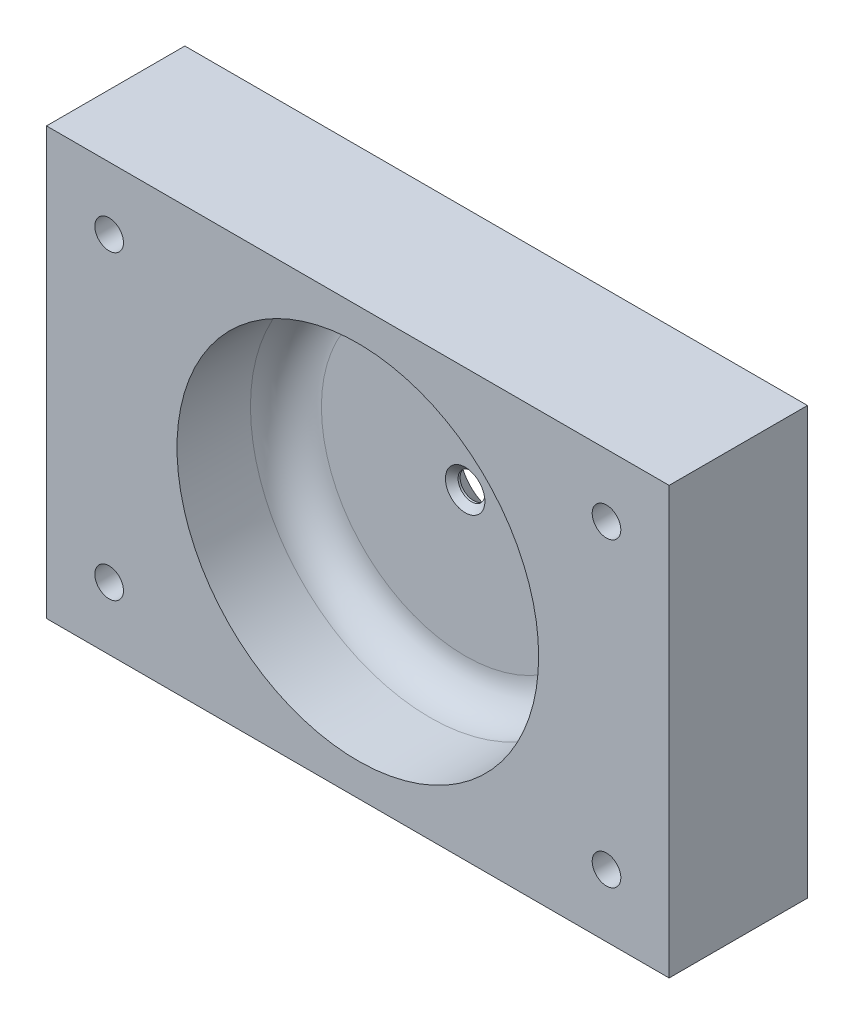
ISO-10303-21;
HEADER;
FILE_DESCRIPTION(('STEP AP214'),'2;1');
FILE_NAME('part.step','',(''),(''),'','','');
FILE_SCHEMA(('AUTOMOTIVE_DESIGN { 1 0 10303 214 1 1 1 1 }'));
ENDSEC;
DATA;
#1=APPLICATION_CONTEXT('core data for automotive mechanical design processes');
#2=APPLICATION_PROTOCOL_DEFINITION('international standard','automotive_design',2000,#1);
#3=PRODUCT_CONTEXT('',#1,'mechanical');
#4=PRODUCT('Part','Part','',(#3));
#5=PRODUCT_RELATED_PRODUCT_CATEGORY('part','',(#4));
#6=PRODUCT_DEFINITION_FORMATION('','',#4);
#7=PRODUCT_DEFINITION_CONTEXT('part definition',#1,'design');
#8=PRODUCT_DEFINITION('design','',#6,#7);
#9=PRODUCT_DEFINITION_SHAPE('','',#8);
#10=(LENGTH_UNIT() NAMED_UNIT(*) SI_UNIT(.MILLI.,.METRE.));
#11=(NAMED_UNIT(*) PLANE_ANGLE_UNIT() SI_UNIT($,.RADIAN.));
#12=(NAMED_UNIT(*) SI_UNIT($,.STERADIAN.) SOLID_ANGLE_UNIT());
#13=UNCERTAINTY_MEASURE_WITH_UNIT(LENGTH_MEASURE(1.E-05),#10,'distance_accuracy_value','');
#14=(GEOMETRIC_REPRESENTATION_CONTEXT(3) GLOBAL_UNCERTAINTY_ASSIGNED_CONTEXT((#13)) GLOBAL_UNIT_ASSIGNED_CONTEXT((#10,
#11,#12)) REPRESENTATION_CONTEXT('',''));
#15=CARTESIAN_POINT('',(0.,0.,0.));
#16=DIRECTION('',(0.,0.,1.));
#17=DIRECTION('',(1.,0.,0.));
#18=AXIS2_PLACEMENT_3D('',#15,#16,#17);
#19=CARTESIAN_POINT('',(0.,0.,-17.3199999999999));
#20=DIRECTION('',(0.,0.,1.));
#21=DIRECTION('',(1.,0.,0.));
#22=AXIS2_PLACEMENT_3D('',#19,#20,#21);
#23=PLANE('',#22);
#24=CARTESIAN_POINT('',(0.,0.,-17.3199999999999));
#25=DIRECTION('',(0.,0.,-1.));
#26=DIRECTION('',(-1.,0.,0.));
#27=AXIS2_PLACEMENT_3D('',#24,#25,#26);
#28=CIRCLE('',#27,20.16);
#29=CARTESIAN_POINT('',(-20.16,0.,-17.3199999999999));
#30=VERTEX_POINT('',#29);
#31=EDGE_CURVE('E392',#30,#30,#28,.T.);
#32=ORIENTED_EDGE('',*,*,#31,.F.);
#33=EDGE_LOOP('',(#32));
#34=FACE_BOUND('',#33,.T.);
#35=CARTESIAN_POINT('',(138.966911279086,84.2062553893646,-17.3199999999999));
#36=DIRECTION('',(0.,0.,-1.));
#37=DIRECTION('',(-1.,0.,0.));
#38=AXIS2_PLACEMENT_3D('',#35,#36,#37);
#39=CIRCLE('',#38,15.);
#40=CARTESIAN_POINT('',(123.966911279086,84.2062553893646,-17.3199999999999));
#41=VERTEX_POINT('',#40);
#42=EDGE_CURVE('E402',#41,#41,#39,.T.);
#43=ORIENTED_EDGE('',*,*,#42,.F.);
#44=EDGE_LOOP('',(#43));
#45=FACE_BOUND('',#44,.T.);
#46=CARTESIAN_POINT('',(-138.966911279086,84.2062553893646,-17.3199999999999));
#47=DIRECTION('',(0.,0.,-1.));
#48=DIRECTION('',(-1.,0.,0.));
#49=AXIS2_PLACEMENT_3D('',#46,#47,#48);
#50=CIRCLE('',#49,15.);
#51=CARTESIAN_POINT('',(-153.966911279086,84.2062553893646,-17.3199999999999));
#52=VERTEX_POINT('',#51);
#53=EDGE_CURVE('E135',#52,#52,#50,.T.);
#54=ORIENTED_EDGE('',*,*,#53,.F.);
#55=EDGE_LOOP('',(#54));
#56=FACE_BOUND('',#55,.T.);
#57=CARTESIAN_POINT('',(-138.966911279086,-84.2062553893646,-17.3199999999999));
#58=DIRECTION('',(0.,0.,-1.));
#59=DIRECTION('',(-1.,0.,0.));
#60=AXIS2_PLACEMENT_3D('',#57,#58,#59);
#61=CIRCLE('',#60,15.);
#62=CARTESIAN_POINT('',(-153.966911279086,-84.2062553893646,-17.3199999999999));
#63=VERTEX_POINT('',#62);
#64=EDGE_CURVE('E122',#63,#63,#61,.T.);
#65=ORIENTED_EDGE('',*,*,#64,.F.);
#66=EDGE_LOOP('',(#65));
#67=FACE_BOUND('',#66,.T.);
#68=CARTESIAN_POINT('',(138.966911279086,-84.2062553893646,-17.3199999999999));
#69=DIRECTION('',(0.,0.,-1.));
#70=DIRECTION('',(-1.,0.,0.));
#71=AXIS2_PLACEMENT_3D('',#68,#69,#70);
#72=CIRCLE('',#71,15.);
#73=CARTESIAN_POINT('',(123.966911279086,-84.2062553893646,-17.3199999999999));
#74=VERTEX_POINT('',#73);
#75=EDGE_CURVE('E118',#74,#74,#72,.T.);
#76=ORIENTED_EDGE('',*,*,#75,.F.);
#77=EDGE_LOOP('',(#76));
#78=FACE_BOUND('',#77,.T.);
#79=DIRECTION('',(0.,-1.,0.));
#80=VECTOR('',#79,1.);
#81=CARTESIAN_POINT('',(-173.966911279086,-119.206255389365,-17.3199999999999));
#82=LINE('',#81,#80);
#83=CARTESIAN_POINT('',(-173.966911279086,119.206255389365,-17.3199999999999));
#84=VERTEX_POINT('',#83);
#85=CARTESIAN_POINT('',(-173.966911279086,-119.206255389365,-17.3199999999999));
#86=VERTEX_POINT('',#85);
#87=EDGE_CURVE('E90',#84,#86,#82,.T.);
#88=ORIENTED_EDGE('',*,*,#87,.F.);
#89=DIRECTION('',(-1.,0.,0.));
#90=VECTOR('',#89,1.);
#91=CARTESIAN_POINT('',(173.966911279086,119.206255389365,-17.3199999999999));
#92=LINE('',#91,#90);
#93=CARTESIAN_POINT('',(173.966911279086,119.206255389365,-17.3199999999999));
#94=VERTEX_POINT('',#93);
#95=EDGE_CURVE('E107',#94,#84,#92,.T.);
#96=ORIENTED_EDGE('',*,*,#95,.F.);
#97=DIRECTION('',(0.,1.,0.));
#98=VECTOR('',#97,1.);
#99=CARTESIAN_POINT('',(173.966911279086,-119.206255389365,-17.3199999999999));
#100=LINE('',#99,#98);
#101=CARTESIAN_POINT('',(173.966911279086,-119.206255389365,-17.3199999999999));
#102=VERTEX_POINT('',#101);
#103=EDGE_CURVE('E92',#102,#94,#100,.T.);
#104=ORIENTED_EDGE('',*,*,#103,.F.);
#105=DIRECTION('',(1.,0.,0.));
#106=VECTOR('',#105,1.);
#107=CARTESIAN_POINT('',(173.966911279086,-119.206255389365,-17.3199999999999));
#108=LINE('',#107,#106);
#109=EDGE_CURVE('E79',#86,#102,#108,.T.);
#110=ORIENTED_EDGE('',*,*,#109,.F.);
#111=EDGE_LOOP('',(#88,#96,#104,#110));
#112=FACE_BOUND('',#111,.T.);
#113=ADVANCED_FACE('F37',(#34,#45,#56,#67,#78,#112),#23,.F.);
#114=CARTESIAN_POINT('',(173.966911279086,119.206255389365,137.32));
#115=DIRECTION('',(0.,-1.,0.));
#116=DIRECTION('',(0.,0.,-1.));
#117=AXIS2_PLACEMENT_3D('',#114,#115,#116);
#118=PLANE('',#117);
#119=DIRECTION('',(0.,0.,-1.));
#120=VECTOR('',#119,1.);
#121=CARTESIAN_POINT('',(-173.966911279086,119.206255389365,137.32));
#122=LINE('',#121,#120);
#123=CARTESIAN_POINT('',(-173.966911279086,119.206255389365,60.0000000000003));
#124=VERTEX_POINT('',#123);
#125=EDGE_CURVE('E95',#124,#84,#122,.T.);
#126=ORIENTED_EDGE('',*,*,#125,.F.);
#127=DIRECTION('',(1.,0.,0.));
#128=VECTOR('',#127,1.);
#129=CARTESIAN_POINT('',(173.966911279086,119.206255389365,60.0000000000004));
#130=LINE('',#129,#128);
#131=CARTESIAN_POINT('',(173.966911279086,119.206255389365,60.0000000000004));
#132=VERTEX_POINT('',#131);
#133=EDGE_CURVE('E84',#124,#132,#130,.T.);
#134=ORIENTED_EDGE('',*,*,#133,.T.);
#135=DIRECTION('',(0.,0.,-1.));
#136=VECTOR('',#135,1.);
#137=CARTESIAN_POINT('',(173.966911279086,119.206255389365,137.32));
#138=LINE('',#137,#136);
#139=EDGE_CURVE('E110',#132,#94,#138,.T.);
#140=ORIENTED_EDGE('',*,*,#139,.T.);
#141=ORIENTED_EDGE('',*,*,#95,.T.);
#142=EDGE_LOOP('',(#126,#134,#140,#141));
#143=FACE_BOUND('',#142,.T.);
#144=ADVANCED_FACE('F160',(#143),#118,.F.);
#145=CARTESIAN_POINT('',(173.966911279086,-119.206255389365,137.32));
#146=DIRECTION('',(-1.,0.,0.));
#147=DIRECTION('',(0.,0.,1.));
#148=AXIS2_PLACEMENT_3D('',#145,#146,#147);
#149=PLANE('',#148);
#150=ORIENTED_EDGE('',*,*,#139,.F.);
#151=DIRECTION('',(0.,-1.,0.));
#152=VECTOR('',#151,1.);
#153=CARTESIAN_POINT('',(173.966911279086,-119.206255389364,59.9999999999996));
#154=LINE('',#153,#152);
#155=CARTESIAN_POINT('',(173.966911279086,-119.206255389365,59.9999999999996));
#156=VERTEX_POINT('',#155);
#157=EDGE_CURVE('E114',#132,#156,#154,.T.);
#158=ORIENTED_EDGE('',*,*,#157,.T.);
#159=DIRECTION('',(0.,0.,-1.));
#160=VECTOR('',#159,1.);
#161=CARTESIAN_POINT('',(173.966911279086,-119.206255389365,137.32));
#162=LINE('',#161,#160);
#163=EDGE_CURVE('E85',#156,#102,#162,.T.);
#164=ORIENTED_EDGE('',*,*,#163,.T.);
#165=ORIENTED_EDGE('',*,*,#103,.T.);
#166=EDGE_LOOP('',(#150,#158,#164,#165));
#167=FACE_BOUND('',#166,.T.);
#168=ADVANCED_FACE('F163',(#167),#149,.F.);
#169=CARTESIAN_POINT('',(173.966911279086,-119.206255389365,137.32));
#170=DIRECTION('',(0.,1.,0.));
#171=DIRECTION('',(0.,0.,1.));
#172=AXIS2_PLACEMENT_3D('',#169,#170,#171);
#173=PLANE('',#172);
#174=ORIENTED_EDGE('',*,*,#163,.F.);
#175=DIRECTION('',(-1.,0.,0.));
#176=VECTOR('',#175,1.);
#177=CARTESIAN_POINT('',(173.966911279086,-119.206255389365,59.9999999999996));
#178=LINE('',#177,#176);
#179=CARTESIAN_POINT('',(-173.966911279086,-119.206255389365,59.9999999999995));
#180=VERTEX_POINT('',#179);
#181=EDGE_CURVE('E55',#156,#180,#178,.T.);
#182=ORIENTED_EDGE('',*,*,#181,.T.);
#183=DIRECTION('',(0.,0.,-1.));
#184=VECTOR('',#183,1.);
#185=CARTESIAN_POINT('',(-173.966911279086,-119.206255389365,137.32));
#186=LINE('',#185,#184);
#187=EDGE_CURVE('E76',#180,#86,#186,.T.);
#188=ORIENTED_EDGE('',*,*,#187,.T.);
#189=ORIENTED_EDGE('',*,*,#109,.T.);
#190=EDGE_LOOP('',(#174,#182,#188,#189));
#191=FACE_BOUND('',#190,.T.);
#192=ADVANCED_FACE('F78',(#191),#173,.F.);
#193=CARTESIAN_POINT('',(-173.966911279086,-119.206255389365,137.32));
#194=DIRECTION('',(1.,0.,0.));
#195=DIRECTION('',(0.,0.,-1.));
#196=AXIS2_PLACEMENT_3D('',#193,#194,#195);
#197=PLANE('',#196);
#198=ORIENTED_EDGE('',*,*,#187,.F.);
#199=DIRECTION('',(0.,1.,0.));
#200=VECTOR('',#199,1.);
#201=CARTESIAN_POINT('',(-173.966911279086,-119.206255389364,59.9999999999995));
#202=LINE('',#201,#200);
#203=EDGE_CURVE('E103',#180,#124,#202,.T.);
#204=ORIENTED_EDGE('',*,*,#203,.T.);
#205=ORIENTED_EDGE('',*,*,#125,.T.);
#206=ORIENTED_EDGE('',*,*,#87,.T.);
#207=EDGE_LOOP('',(#198,#204,#205,#206));
#208=FACE_BOUND('',#207,.T.);
#209=ADVANCED_FACE('F39',(#208),#197,.F.);
#210=CARTESIAN_POINT('',(101.047303433264,-2.11405492550896,60.));
#211=DIRECTION('',(0.,0.,-1.));
#212=DIRECTION('',(2.18740183890407E-07,0.999999999999976,0.));
#213=AXIS2_PLACEMENT_3D('',#210,#211,#212);
#214=PLANE('',#213);
#215=CARTESIAN_POINT('',(138.966911279086,84.2062553893646,60.0000000000003));
#216=DIRECTION('',(0.,0.,-1.));
#217=DIRECTION('',(0.,1.,0.));
#218=AXIS2_PLACEMENT_3D('',#215,#216,#217);
#219=CIRCLE('',#218,8.00000000000001);
#220=CARTESIAN_POINT('',(138.966911279086,92.2062553893646,60.0000000000003));
#221=VERTEX_POINT('',#220);
#222=EDGE_CURVE('E41',#221,#221,#219,.T.);
#223=ORIENTED_EDGE('',*,*,#222,.T.);
#224=EDGE_LOOP('',(#223));
#225=FACE_BOUND('',#224,.T.);
#226=CARTESIAN_POINT('',(-138.966911279086,84.2062553893646,60.0000000000002));
#227=DIRECTION('',(0.,0.,-1.));
#228=DIRECTION('',(0.,1.,0.));
#229=AXIS2_PLACEMENT_3D('',#226,#227,#228);
#230=CIRCLE('',#229,8.00000000000001);
#231=CARTESIAN_POINT('',(-138.966911279086,92.2062553893646,60.0000000000002));
#232=VERTEX_POINT('',#231);
#233=EDGE_CURVE('E120',#232,#232,#230,.T.);
#234=ORIENTED_EDGE('',*,*,#233,.T.);
#235=EDGE_LOOP('',(#234));
#236=FACE_BOUND('',#235,.T.);
#237=CARTESIAN_POINT('',(-138.966911279086,-84.2062553893646,59.9999999999996));
#238=DIRECTION('',(0.,0.,-1.));
#239=DIRECTION('',(0.,1.,0.));
#240=AXIS2_PLACEMENT_3D('',#237,#238,#239);
#241=CIRCLE('',#240,8.00000000000001);
#242=CARTESIAN_POINT('',(-138.966911279086,-76.2062553893646,59.9999999999997));
#243=VERTEX_POINT('',#242);
#244=EDGE_CURVE('E116',#243,#243,#241,.T.);
#245=ORIENTED_EDGE('',*,*,#244,.T.);
#246=EDGE_LOOP('',(#245));
#247=FACE_BOUND('',#246,.T.);
#248=CARTESIAN_POINT('',(138.966911279086,-84.2062553893646,59.9999999999997));
#249=DIRECTION('',(0.,0.,-1.));
#250=DIRECTION('',(0.,1.,0.));
#251=AXIS2_PLACEMENT_3D('',#248,#249,#250);
#252=CIRCLE('',#251,8.00000000000001);
#253=CARTESIAN_POINT('',(138.966911279086,-76.2062553893646,59.9999999999998));
#254=VERTEX_POINT('',#253);
#255=EDGE_CURVE('E97',#254,#254,#252,.T.);
#256=ORIENTED_EDGE('',*,*,#255,.T.);
#257=EDGE_LOOP('',(#256));
#258=FACE_BOUND('',#257,.T.);
#259=CARTESIAN_POINT('',(0.,0.,60.));
#260=DIRECTION('',(0.,0.,1.));
#261=DIRECTION('',(1.,0.,0.));
#262=AXIS2_PLACEMENT_3D('',#259,#260,#261);
#263=CIRCLE('',#262,101.047303895693);
#264=CARTESIAN_POINT('',(101.047303895693,0.,60.));
#265=VERTEX_POINT('',#264);
#266=EDGE_CURVE('E152',#265,#265,#263,.T.);
#267=ORIENTED_EDGE('',*,*,#266,.F.);
#268=EDGE_LOOP('',(#267));
#269=FACE_BOUND('',#268,.T.);
#270=ORIENTED_EDGE('',*,*,#181,.F.);
#271=ORIENTED_EDGE('',*,*,#157,.F.);
#272=ORIENTED_EDGE('',*,*,#133,.F.);
#273=ORIENTED_EDGE('',*,*,#203,.F.);
#274=EDGE_LOOP('',(#270,#271,#272,#273));
#275=FACE_BOUND('',#274,.T.);
#276=ADVANCED_FACE('F164',(#225,#236,#247,#258,#269,#275),#214,.F.);
#277=CARTESIAN_POINT('',(0.,0.,0.));
#278=DIRECTION('',(0.,0.,1.));
#279=DIRECTION('',(1.,0.,0.));
#280=AXIS2_PLACEMENT_3D('',#277,#278,#279);
#281=PLANE('',#280);
#282=CARTESIAN_POINT('',(0.,0.,0.));
#283=DIRECTION('',(0.,0.,-1.));
#284=DIRECTION('',(-1.,0.,0.));
#285=AXIS2_PLACEMENT_3D('',#282,#283,#284);
#286=CIRCLE('',#285,11.025);
#287=CARTESIAN_POINT('',(-11.025,0.,0.));
#288=VERTEX_POINT('',#287);
#289=EDGE_CURVE('E393',#288,#288,#286,.T.);
#290=ORIENTED_EDGE('',*,*,#289,.T.);
#291=EDGE_LOOP('',(#290));
#292=FACE_BOUND('',#291,.T.);
#293=CARTESIAN_POINT('',(0.,0.,0.));
#294=DIRECTION('',(0.,0.,1.));
#295=DIRECTION('',(1.,0.,0.));
#296=AXIS2_PLACEMENT_3D('',#293,#294,#295);
#297=CIRCLE('',#296,80.3460547376862);
#298=CARTESIAN_POINT('',(80.3460547376862,0.,0.));
#299=VERTEX_POINT('',#298);
#300=EDGE_CURVE('E47',#299,#299,#297,.F.);
#301=ORIENTED_EDGE('',*,*,#300,.F.);
#302=EDGE_LOOP('',(#301));
#303=FACE_BOUND('',#302,.T.);
#304=ADVANCED_FACE('F166',(#292,#303),#281,.T.);
#305=CARTESIAN_POINT('',(0.,0.,20.));
#306=DIRECTION('',(0.,0.,1.));
#307=DIRECTION('',(1.,0.,0.));
#308=AXIS2_PLACEMENT_3D('',#305,#306,#307);
#309=TOROIDAL_SURFACE('',#308,80.3460547376862,20.);
#310=ORIENTED_EDGE('',*,*,#300,.T.);
#311=EDGE_LOOP('',(#310));
#312=FACE_BOUND('',#311,.T.);
#313=CARTESIAN_POINT('',(0.,0.,19.6509518712543));
#314=DIRECTION('',(0.,0.,1.));
#315=DIRECTION('',(1.,0.,0.));
#316=AXIS2_PLACEMENT_3D('',#313,#314,#315);
#317=CIRCLE('',#316,100.343008640814);
#318=CARTESIAN_POINT('',(100.343008640814,0.,19.6509518712543));
#319=VERTEX_POINT('',#318);
#320=EDGE_CURVE('E11',#319,#319,#317,.T.);
#321=ORIENTED_EDGE('',*,*,#320,.T.);
#322=EDGE_LOOP('',(#321));
#323=FACE_BOUND('',#322,.T.);
#324=ADVANCED_FACE('F173',(#312,#323),#309,.F.);
#325=CARTESIAN_POINT('',(0.,0.,0.));
#326=DIRECTION('',(0.,0.,1.));
#327=DIRECTION('',(-1.,0.,0.));
#328=AXIS2_PLACEMENT_3D('',#325,#326,#327);
#329=CONICAL_SURFACE('',#328,100.,0.0174532925199433);
#330=ORIENTED_EDGE('',*,*,#320,.F.);
#331=EDGE_LOOP('',(#330));
#332=FACE_BOUND('',#331,.T.);
#333=ORIENTED_EDGE('',*,*,#266,.T.);
#334=EDGE_LOOP('',(#333));
#335=FACE_BOUND('',#334,.T.);
#336=ADVANCED_FACE('F227',(#332,#335),#329,.F.);
#337=CARTESIAN_POINT('',(138.966911279086,-84.2062553893646,-17.3199999999999));
#338=DIRECTION('',(0.,0.,-1.));
#339=DIRECTION('',(-1.,0.,0.));
#340=AXIS2_PLACEMENT_3D('',#337,#338,#339);
#341=CYLINDRICAL_SURFACE('',#340,8.00000000000001);
#342=CARTESIAN_POINT('',(138.966911279086,-84.2062553893646,-2.3199999999999));
#343=DIRECTION('',(0.,0.,-1.));
#344=DIRECTION('',(-1.,0.,0.));
#345=AXIS2_PLACEMENT_3D('',#342,#343,#344);
#346=CIRCLE('',#345,8.00000000000001);
#347=CARTESIAN_POINT('',(130.966911279086,-84.2062553893646,-2.3199999999999));
#348=VERTEX_POINT('',#347);
#349=EDGE_CURVE('E100',#348,#348,#346,.T.);
#350=ORIENTED_EDGE('',*,*,#349,.T.);
#351=EDGE_LOOP('',(#350));
#352=FACE_BOUND('',#351,.T.);
#353=ORIENTED_EDGE('',*,*,#255,.F.);
#354=EDGE_LOOP('',(#353));
#355=FACE_BOUND('',#354,.T.);
#356=ADVANCED_FACE('F237',(#352,#355),#341,.F.);
#357=CARTESIAN_POINT('',(146.966911279086,-84.2062553893646,-2.3199999999999));
#358=DIRECTION('',(0.,0.,1.));
#359=DIRECTION('',(1.,0.,0.));
#360=AXIS2_PLACEMENT_3D('',#357,#358,#359);
#361=PLANE('',#360);
#362=ORIENTED_EDGE('',*,*,#349,.F.);
#363=EDGE_LOOP('',(#362));
#364=FACE_BOUND('',#363,.T.);
#365=CARTESIAN_POINT('',(138.966911279086,-84.2062553893646,-2.3199999999999));
#366=DIRECTION('',(0.,0.,-1.));
#367=DIRECTION('',(-1.,0.,0.));
#368=AXIS2_PLACEMENT_3D('',#365,#366,#367);
#369=CIRCLE('',#368,15.);
#370=CARTESIAN_POINT('',(123.966911279086,-84.2062553893646,-2.3199999999999));
#371=VERTEX_POINT('',#370);
#372=EDGE_CURVE('E145',#371,#371,#369,.T.);
#373=ORIENTED_EDGE('',*,*,#372,.T.);
#374=EDGE_LOOP('',(#373));
#375=FACE_BOUND('',#374,.T.);
#376=ADVANCED_FACE('F246',(#364,#375),#361,.F.);
#377=CARTESIAN_POINT('',(138.966911279086,-84.2062553893646,-17.3199999999999));
#378=DIRECTION('',(0.,0.,-1.));
#379=DIRECTION('',(-1.,0.,0.));
#380=AXIS2_PLACEMENT_3D('',#377,#378,#379);
#381=CYLINDRICAL_SURFACE('',#380,15.);
#382=ORIENTED_EDGE('',*,*,#372,.F.);
#383=EDGE_LOOP('',(#382));
#384=FACE_BOUND('',#383,.T.);
#385=ORIENTED_EDGE('',*,*,#75,.T.);
#386=EDGE_LOOP('',(#385));
#387=FACE_BOUND('',#386,.T.);
#388=ADVANCED_FACE('F255',(#384,#387),#381,.F.);
#389=CARTESIAN_POINT('',(-138.966911279086,-84.2062553893646,-17.3199999999999));
#390=DIRECTION('',(0.,0.,-1.));
#391=DIRECTION('',(-1.,0.,0.));
#392=AXIS2_PLACEMENT_3D('',#389,#390,#391);
#393=CYLINDRICAL_SURFACE('',#392,8.00000000000001);
#394=CARTESIAN_POINT('',(-138.966911279086,-84.2062553893646,-2.3199999999999));
#395=DIRECTION('',(0.,0.,-1.));
#396=DIRECTION('',(-1.,0.,0.));
#397=AXIS2_PLACEMENT_3D('',#394,#395,#396);
#398=CIRCLE('',#397,8.00000000000001);
#399=CARTESIAN_POINT('',(-146.966911279086,-84.2062553893646,-2.3199999999999));
#400=VERTEX_POINT('',#399);
#401=EDGE_CURVE('E119',#400,#400,#398,.T.);
#402=ORIENTED_EDGE('',*,*,#401,.T.);
#403=EDGE_LOOP('',(#402));
#404=FACE_BOUND('',#403,.T.);
#405=ORIENTED_EDGE('',*,*,#244,.F.);
#406=EDGE_LOOP('',(#405));
#407=FACE_BOUND('',#406,.T.);
#408=ADVANCED_FACE('F264',(#404,#407),#393,.F.);
#409=CARTESIAN_POINT('',(-130.966911279086,-84.2062553893646,-2.3199999999999));
#410=DIRECTION('',(0.,0.,1.));
#411=DIRECTION('',(1.,0.,0.));
#412=AXIS2_PLACEMENT_3D('',#409,#410,#411);
#413=PLANE('',#412);
#414=ORIENTED_EDGE('',*,*,#401,.F.);
#415=EDGE_LOOP('',(#414));
#416=FACE_BOUND('',#415,.T.);
#417=CARTESIAN_POINT('',(-138.966911279086,-84.2062553893646,-2.3199999999999));
#418=DIRECTION('',(0.,0.,-1.));
#419=DIRECTION('',(-1.,0.,0.));
#420=AXIS2_PLACEMENT_3D('',#417,#418,#419);
#421=CIRCLE('',#420,15.);
#422=CARTESIAN_POINT('',(-153.966911279086,-84.2062553893646,-2.3199999999999));
#423=VERTEX_POINT('',#422);
#424=EDGE_CURVE('E127',#423,#423,#421,.T.);
#425=ORIENTED_EDGE('',*,*,#424,.T.);
#426=EDGE_LOOP('',(#425));
#427=FACE_BOUND('',#426,.T.);
#428=ADVANCED_FACE('F273',(#416,#427),#413,.F.);
#429=CARTESIAN_POINT('',(-138.966911279086,-84.2062553893646,-17.3199999999999));
#430=DIRECTION('',(0.,0.,-1.));
#431=DIRECTION('',(-1.,0.,0.));
#432=AXIS2_PLACEMENT_3D('',#429,#430,#431);
#433=CYLINDRICAL_SURFACE('',#432,15.);
#434=ORIENTED_EDGE('',*,*,#424,.F.);
#435=EDGE_LOOP('',(#434));
#436=FACE_BOUND('',#435,.T.);
#437=ORIENTED_EDGE('',*,*,#64,.T.);
#438=EDGE_LOOP('',(#437));
#439=FACE_BOUND('',#438,.T.);
#440=ADVANCED_FACE('F282',(#436,#439),#433,.F.);
#441=CARTESIAN_POINT('',(-138.966911279086,84.2062553893646,-17.3199999999999));
#442=DIRECTION('',(0.,0.,-1.));
#443=DIRECTION('',(-1.,0.,0.));
#444=AXIS2_PLACEMENT_3D('',#441,#442,#443);
#445=CYLINDRICAL_SURFACE('',#444,8.00000000000001);
#446=CARTESIAN_POINT('',(-138.966911279086,84.2062553893646,-2.3199999999999));
#447=DIRECTION('',(0.,0.,-1.));
#448=DIRECTION('',(-1.,0.,0.));
#449=AXIS2_PLACEMENT_3D('',#446,#447,#448);
#450=CIRCLE('',#449,8.00000000000001);
#451=CARTESIAN_POINT('',(-146.966911279086,84.2062553893646,-2.3199999999999));
#452=VERTEX_POINT('',#451);
#453=EDGE_CURVE('E123',#452,#452,#450,.T.);
#454=ORIENTED_EDGE('',*,*,#453,.T.);
#455=EDGE_LOOP('',(#454));
#456=FACE_BOUND('',#455,.T.);
#457=ORIENTED_EDGE('',*,*,#233,.F.);
#458=EDGE_LOOP('',(#457));
#459=FACE_BOUND('',#458,.T.);
#460=ADVANCED_FACE('F291',(#456,#459),#445,.F.);
#461=CARTESIAN_POINT('',(-130.966911279086,84.2062553893646,-2.3199999999999));
#462=DIRECTION('',(0.,0.,1.));
#463=DIRECTION('',(1.,0.,0.));
#464=AXIS2_PLACEMENT_3D('',#461,#462,#463);
#465=PLANE('',#464);
#466=ORIENTED_EDGE('',*,*,#453,.F.);
#467=EDGE_LOOP('',(#466));
#468=FACE_BOUND('',#467,.T.);
#469=CARTESIAN_POINT('',(-138.966911279086,84.2062553893646,-2.3199999999999));
#470=DIRECTION('',(0.,0.,-1.));
#471=DIRECTION('',(-1.,0.,0.));
#472=AXIS2_PLACEMENT_3D('',#469,#470,#471);
#473=CIRCLE('',#472,15.);
#474=CARTESIAN_POINT('',(-153.966911279086,84.2062553893646,-2.3199999999999));
#475=VERTEX_POINT('',#474);
#476=EDGE_CURVE('E130',#475,#475,#473,.T.);
#477=ORIENTED_EDGE('',*,*,#476,.T.);
#478=EDGE_LOOP('',(#477));
#479=FACE_BOUND('',#478,.T.);
#480=ADVANCED_FACE('F300',(#468,#479),#465,.F.);
#481=CARTESIAN_POINT('',(-138.966911279086,84.2062553893646,-17.3199999999999));
#482=DIRECTION('',(0.,0.,-1.));
#483=DIRECTION('',(-1.,0.,0.));
#484=AXIS2_PLACEMENT_3D('',#481,#482,#483);
#485=CYLINDRICAL_SURFACE('',#484,15.);
#486=ORIENTED_EDGE('',*,*,#476,.F.);
#487=EDGE_LOOP('',(#486));
#488=FACE_BOUND('',#487,.T.);
#489=ORIENTED_EDGE('',*,*,#53,.T.);
#490=EDGE_LOOP('',(#489));
#491=FACE_BOUND('',#490,.T.);
#492=ADVANCED_FACE('F308',(#488,#491),#485,.F.);
#493=CARTESIAN_POINT('',(138.966911279086,84.2062553893646,-17.3199999999999));
#494=DIRECTION('',(0.,0.,-1.));
#495=DIRECTION('',(-1.,0.,0.));
#496=AXIS2_PLACEMENT_3D('',#493,#494,#495);
#497=CYLINDRICAL_SURFACE('',#496,8.00000000000001);
#498=CARTESIAN_POINT('',(138.966911279086,84.2062553893646,-2.3199999999999));
#499=DIRECTION('',(0.,0.,-1.));
#500=DIRECTION('',(-1.,0.,0.));
#501=AXIS2_PLACEMENT_3D('',#498,#499,#500);
#502=CIRCLE('',#501,8.00000000000001);
#503=CARTESIAN_POINT('',(130.966911279086,84.2062553893646,-2.3199999999999));
#504=VERTEX_POINT('',#503);
#505=EDGE_CURVE('E408',#504,#504,#502,.T.);
#506=ORIENTED_EDGE('',*,*,#505,.T.);
#507=EDGE_LOOP('',(#506));
#508=FACE_BOUND('',#507,.T.);
#509=ORIENTED_EDGE('',*,*,#222,.F.);
#510=EDGE_LOOP('',(#509));
#511=FACE_BOUND('',#510,.T.);
#512=ADVANCED_FACE('F317',(#508,#511),#497,.F.);
#513=CARTESIAN_POINT('',(146.966911279086,84.2062553893646,-2.3199999999999));
#514=DIRECTION('',(0.,0.,1.));
#515=DIRECTION('',(1.,0.,0.));
#516=AXIS2_PLACEMENT_3D('',#513,#514,#515);
#517=PLANE('',#516);
#518=ORIENTED_EDGE('',*,*,#505,.F.);
#519=EDGE_LOOP('',(#518));
#520=FACE_BOUND('',#519,.T.);
#521=CARTESIAN_POINT('',(138.966911279086,84.2062553893646,-2.3199999999999));
#522=DIRECTION('',(0.,0.,-1.));
#523=DIRECTION('',(-1.,0.,0.));
#524=AXIS2_PLACEMENT_3D('',#521,#522,#523);
#525=CIRCLE('',#524,15.);
#526=CARTESIAN_POINT('',(123.966911279086,84.2062553893646,-2.3199999999999));
#527=VERTEX_POINT('',#526);
#528=EDGE_CURVE('E405',#527,#527,#525,.T.);
#529=ORIENTED_EDGE('',*,*,#528,.T.);
#530=EDGE_LOOP('',(#529));
#531=FACE_BOUND('',#530,.T.);
#532=ADVANCED_FACE('F326',(#520,#531),#517,.F.);
#533=CARTESIAN_POINT('',(138.966911279086,84.2062553893646,-17.3199999999999));
#534=DIRECTION('',(0.,0.,-1.));
#535=DIRECTION('',(-1.,0.,0.));
#536=AXIS2_PLACEMENT_3D('',#533,#534,#535);
#537=CYLINDRICAL_SURFACE('',#536,15.);
#538=ORIENTED_EDGE('',*,*,#528,.F.);
#539=EDGE_LOOP('',(#538));
#540=FACE_BOUND('',#539,.T.);
#541=ORIENTED_EDGE('',*,*,#42,.T.);
#542=EDGE_LOOP('',(#541));
#543=FACE_BOUND('',#542,.T.);
#544=ADVANCED_FACE('F335',(#540,#543),#537,.F.);
#545=CARTESIAN_POINT('',(0.,0.,-3.52500000000001));
#546=DIRECTION('',(0.,0.,1.));
#547=DIRECTION('',(1.,0.,0.));
#548=AXIS2_PLACEMENT_3D('',#545,#546,#547);
#549=CONICAL_SURFACE('',#548,7.5,0.785398163397448);
#550=ORIENTED_EDGE('',*,*,#289,.F.);
#551=EDGE_LOOP('',(#550));
#552=FACE_BOUND('',#551,.T.);
#553=CARTESIAN_POINT('',(0.,0.,-3.52500000000001));
#554=DIRECTION('',(0.,0.,-1.));
#555=DIRECTION('',(-1.,0.,0.));
#556=AXIS2_PLACEMENT_3D('',#553,#554,#555);
#557=CIRCLE('',#556,7.5);
#558=CARTESIAN_POINT('',(-7.5,0.,-3.52500000000001));
#559=VERTEX_POINT('',#558);
#560=EDGE_CURVE('E395',#559,#559,#557,.T.);
#561=ORIENTED_EDGE('',*,*,#560,.T.);
#562=EDGE_LOOP('',(#561));
#563=FACE_BOUND('',#562,.T.);
#564=ADVANCED_FACE('F344',(#552,#563),#549,.F.);
#565=CARTESIAN_POINT('',(0.,0.,-17.3199999999999));
#566=DIRECTION('',(0.,0.,-1.));
#567=DIRECTION('',(-1.,0.,0.));
#568=AXIS2_PLACEMENT_3D('',#565,#566,#567);
#569=CYLINDRICAL_SURFACE('',#568,7.5);
#570=ORIENTED_EDGE('',*,*,#560,.F.);
#571=EDGE_LOOP('',(#570));
#572=FACE_BOUND('',#571,.T.);
#573=CARTESIAN_POINT('',(0.,0.,-4.6599999999999));
#574=DIRECTION('',(0.,0.,-1.));
#575=DIRECTION('',(-1.,0.,0.));
#576=AXIS2_PLACEMENT_3D('',#573,#574,#575);
#577=CIRCLE('',#576,7.5);
#578=CARTESIAN_POINT('',(-7.5,0.,-4.6599999999999));
#579=VERTEX_POINT('',#578);
#580=EDGE_CURVE('E390',#579,#579,#577,.T.);
#581=ORIENTED_EDGE('',*,*,#580,.T.);
#582=EDGE_LOOP('',(#581));
#583=FACE_BOUND('',#582,.T.);
#584=ADVANCED_FACE('F352',(#572,#583),#569,.F.);
#585=CARTESIAN_POINT('',(0.,0.,-17.3199999999999));
#586=DIRECTION('',(0.,0.,-1.));
#587=DIRECTION('',(-1.,0.,0.));
#588=AXIS2_PLACEMENT_3D('',#585,#586,#587);
#589=CONICAL_SURFACE('',#588,20.16,0.785398163397449);
#590=ORIENTED_EDGE('',*,*,#580,.F.);
#591=EDGE_LOOP('',(#590));
#592=FACE_BOUND('',#591,.T.);
#593=ORIENTED_EDGE('',*,*,#31,.T.);
#594=EDGE_LOOP('',(#593));
#595=FACE_BOUND('',#594,.T.);
#596=ADVANCED_FACE('F361',(#592,#595),#589,.F.);
#597=CLOSED_SHELL('',(#113,#144,#168,#192,#209,#276,#304,#324,#336,#356,#376,#388,#408,#428,
#440,#460,#480,#492,#512,#532,#544,#564,#584,#596));
#598=MANIFOLD_SOLID_BREP('B2',#597);
#599=ADVANCED_BREP_SHAPE_REPRESENTATION('',(#18,#598),#14);
#600=SHAPE_DEFINITION_REPRESENTATION(#9,#599);
ENDSEC;
END-ISO-10303-21;
